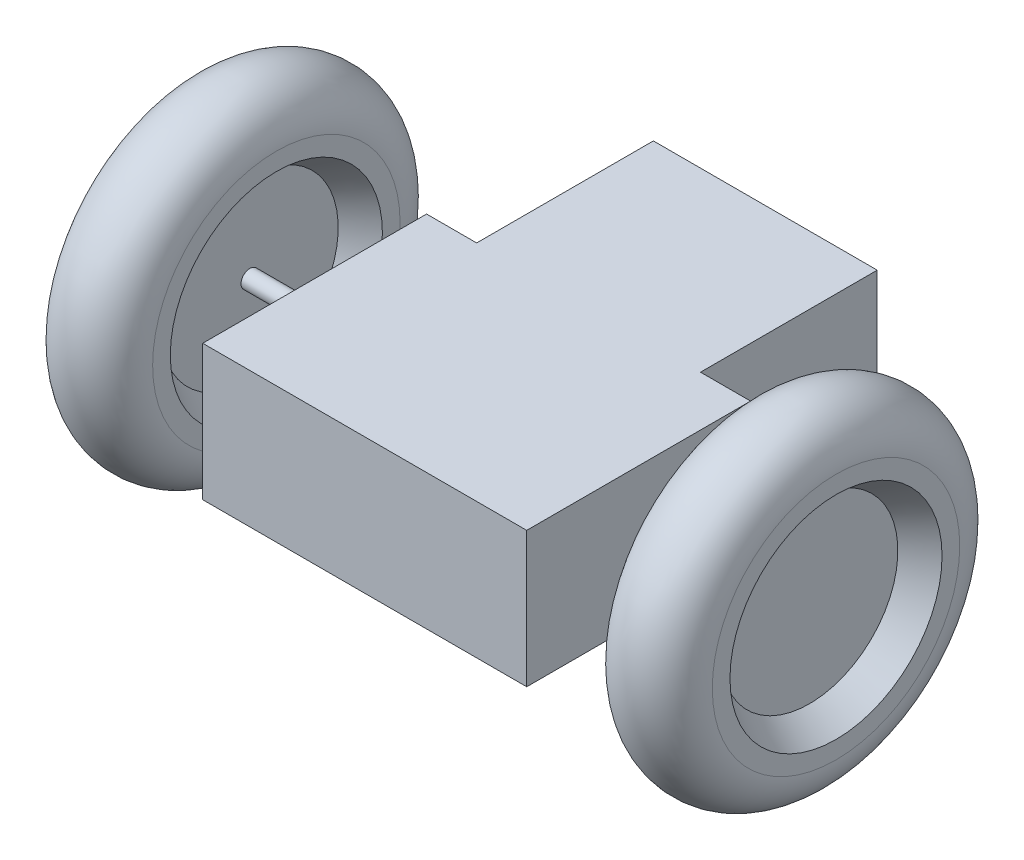
ISO-10303-21;
HEADER;
FILE_DESCRIPTION(('STEP AP214'),'2;1');
FILE_NAME('part.step','',(''),(''),'','','');
FILE_SCHEMA(('AUTOMOTIVE_DESIGN { 1 0 10303 214 1 1 1 1 }'));
ENDSEC;
DATA;
#1=APPLICATION_CONTEXT('core data for automotive mechanical design processes');
#2=APPLICATION_PROTOCOL_DEFINITION('international standard','automotive_design',2000,#1);
#3=PRODUCT_CONTEXT('',#1,'mechanical');
#4=PRODUCT('Part','Part','',(#3));
#5=PRODUCT_RELATED_PRODUCT_CATEGORY('part','',(#4));
#6=PRODUCT_DEFINITION_FORMATION('','',#4);
#7=PRODUCT_DEFINITION_CONTEXT('part definition',#1,'design');
#8=PRODUCT_DEFINITION('design','',#6,#7);
#9=PRODUCT_DEFINITION_SHAPE('','',#8);
#10=(LENGTH_UNIT() NAMED_UNIT(*) SI_UNIT(.MILLI.,.METRE.));
#11=(NAMED_UNIT(*) PLANE_ANGLE_UNIT() SI_UNIT($,.RADIAN.));
#12=(NAMED_UNIT(*) SI_UNIT($,.STERADIAN.) SOLID_ANGLE_UNIT());
#13=UNCERTAINTY_MEASURE_WITH_UNIT(LENGTH_MEASURE(1.E-05),#10,'distance_accuracy_value','');
#14=(GEOMETRIC_REPRESENTATION_CONTEXT(3) GLOBAL_UNCERTAINTY_ASSIGNED_CONTEXT((#13)) GLOBAL_UNIT_ASSIGNED_CONTEXT((#10,
#11,#12)) REPRESENTATION_CONTEXT('',''));
#15=CARTESIAN_POINT('',(0.,0.,0.));
#16=DIRECTION('',(0.,0.,1.));
#17=DIRECTION('',(1.,0.,0.));
#18=AXIS2_PLACEMENT_3D('',#15,#16,#17);
#19=CARTESIAN_POINT('',(27.5,-11.5,-34.));
#20=DIRECTION('',(1.,0.,0.));
#21=DIRECTION('',(0.,0.,-1.));
#22=AXIS2_PLACEMENT_3D('',#19,#20,#21);
#23=PLANE('',#22);
#24=DIRECTION('',(0.,-1.,0.));
#25=VECTOR('',#24,1.);
#26=CARTESIAN_POINT('',(27.5,-9.5,19.));
#27=LINE('',#26,#25);
#28=CARTESIAN_POINT('',(27.5,-9.5,19.));
#29=VERTEX_POINT('',#28);
#30=CARTESIAN_POINT('',(27.5,-11.5,19.));
#31=VERTEX_POINT('',#30);
#32=EDGE_CURVE('E55',#29,#31,#27,.T.);
#33=ORIENTED_EDGE('',*,*,#32,.F.);
#34=DIRECTION('',(0.,0.,-1.));
#35=VECTOR('',#34,1.);
#36=CARTESIAN_POINT('',(27.5,-9.5,19.));
#37=LINE('',#36,#35);
#38=CARTESIAN_POINT('',(27.5,-9.5,11.));
#39=VERTEX_POINT('',#38);
#40=EDGE_CURVE('E50',#29,#39,#37,.T.);
#41=ORIENTED_EDGE('',*,*,#40,.T.);
#42=DIRECTION('',(0.,-1.,0.));
#43=VECTOR('',#42,1.);
#44=CARTESIAN_POINT('',(27.5,-9.5,11.));
#45=LINE('',#44,#43);
#46=CARTESIAN_POINT('',(27.5,-11.5,11.));
#47=VERTEX_POINT('',#46);
#48=EDGE_CURVE('E159',#39,#47,#45,.T.);
#49=ORIENTED_EDGE('',*,*,#48,.T.);
#50=DIRECTION('',(0.,0.,-1.));
#51=VECTOR('',#50,1.);
#52=CARTESIAN_POINT('',(27.5,-11.5,-34.));
#53=LINE('',#52,#51);
#54=CARTESIAN_POINT('',(27.5,-11.5,-4.00000000000001));
#55=VERTEX_POINT('',#54);
#56=EDGE_CURVE('E314',#47,#55,#53,.T.);
#57=ORIENTED_EDGE('',*,*,#56,.T.);
#58=DIRECTION('',(0.,1.,0.));
#59=VECTOR('',#58,1.);
#60=CARTESIAN_POINT('',(27.5,-28.5,-4.00000000000001));
#61=LINE('',#60,#59);
#62=CARTESIAN_POINT('',(27.5,11.5,-4.00000000000001));
#63=VERTEX_POINT('',#62);
#64=EDGE_CURVE('E226',#55,#63,#61,.T.);
#65=ORIENTED_EDGE('',*,*,#64,.T.);
#66=DIRECTION('',(0.,0.,-1.));
#67=VECTOR('',#66,1.);
#68=CARTESIAN_POINT('',(27.5,11.5,-34.));
#69=LINE('',#68,#67);
#70=CARTESIAN_POINT('',(27.5,11.5,34.));
#71=VERTEX_POINT('',#70);
#72=EDGE_CURVE('E303',#71,#63,#69,.T.);
#73=ORIENTED_EDGE('',*,*,#72,.F.);
#74=DIRECTION('',(0.,1.,0.));
#75=VECTOR('',#74,1.);
#76=CARTESIAN_POINT('',(27.5,-11.5,34.));
#77=LINE('',#76,#75);
#78=CARTESIAN_POINT('',(27.5,-11.5,34.));
#79=VERTEX_POINT('',#78);
#80=EDGE_CURVE('E43',#79,#71,#77,.T.);
#81=ORIENTED_EDGE('',*,*,#80,.F.);
#82=EDGE_CURVE('E315',#79,#31,#53,.T.);
#83=ORIENTED_EDGE('',*,*,#82,.T.);
#84=EDGE_LOOP('',(#33,#41,#49,#57,#65,#73,#81,#83));
#85=FACE_BOUND('',#84,.T.);
#86=CARTESIAN_POINT('',(27.5,0.,9.));
#87=DIRECTION('',(1.,0.,0.));
#88=DIRECTION('',(0.,0.,-1.));
#89=AXIS2_PLACEMENT_3D('',#86,#87,#88);
#90=CIRCLE('',#89,1.5);
#91=CARTESIAN_POINT('',(27.5,0.,7.5));
#92=VERTEX_POINT('',#91);
#93=EDGE_CURVE('E295',#92,#92,#90,.T.);
#94=ORIENTED_EDGE('',*,*,#93,.F.);
#95=EDGE_LOOP('',(#94));
#96=FACE_BOUND('',#95,.T.);
#97=ADVANCED_FACE('F35',(#85,#96),#23,.T.);
#98=CARTESIAN_POINT('',(-27.5,-11.5,-34.));
#99=DIRECTION('',(-1.,0.,0.));
#100=DIRECTION('',(0.,0.,1.));
#101=AXIS2_PLACEMENT_3D('',#98,#99,#100);
#102=PLANE('',#101);
#103=DIRECTION('',(0.,-1.,0.));
#104=VECTOR('',#103,1.);
#105=CARTESIAN_POINT('',(-27.5,-9.5,11.));
#106=LINE('',#105,#104);
#107=CARTESIAN_POINT('',(-27.5,-9.5,11.));
#108=VERTEX_POINT('',#107);
#109=CARTESIAN_POINT('',(-27.5,-11.5,11.));
#110=VERTEX_POINT('',#109);
#111=EDGE_CURVE('E211',#108,#110,#106,.T.);
#112=ORIENTED_EDGE('',*,*,#111,.F.);
#113=DIRECTION('',(0.,0.,1.));
#114=VECTOR('',#113,1.);
#115=CARTESIAN_POINT('',(-27.5,-9.5,19.));
#116=LINE('',#115,#114);
#117=CARTESIAN_POINT('',(-27.5,-9.5,19.));
#118=VERTEX_POINT('',#117);
#119=EDGE_CURVE('E191',#108,#118,#116,.T.);
#120=ORIENTED_EDGE('',*,*,#119,.T.);
#121=DIRECTION('',(0.,-1.,0.));
#122=VECTOR('',#121,1.);
#123=CARTESIAN_POINT('',(-27.5,-9.5,19.));
#124=LINE('',#123,#122);
#125=CARTESIAN_POINT('',(-27.5,-11.5,19.));
#126=VERTEX_POINT('',#125);
#127=EDGE_CURVE('E203',#118,#126,#124,.T.);
#128=ORIENTED_EDGE('',*,*,#127,.T.);
#129=DIRECTION('',(0.,0.,1.));
#130=VECTOR('',#129,1.);
#131=CARTESIAN_POINT('',(-27.5,-11.5,-34.));
#132=LINE('',#131,#130);
#133=CARTESIAN_POINT('',(-27.5,-11.5,34.));
#134=VERTEX_POINT('',#133);
#135=EDGE_CURVE('E308',#126,#134,#132,.T.);
#136=ORIENTED_EDGE('',*,*,#135,.T.);
#137=DIRECTION('',(0.,1.,0.));
#138=VECTOR('',#137,1.);
#139=CARTESIAN_POINT('',(-27.5,-11.5,34.));
#140=LINE('',#139,#138);
#141=CARTESIAN_POINT('',(-27.5,11.5,34.));
#142=VERTEX_POINT('',#141);
#143=EDGE_CURVE('E319',#134,#142,#140,.T.);
#144=ORIENTED_EDGE('',*,*,#143,.T.);
#145=DIRECTION('',(0.,0.,1.));
#146=VECTOR('',#145,1.);
#147=CARTESIAN_POINT('',(-27.5,11.5,-34.));
#148=LINE('',#147,#146);
#149=CARTESIAN_POINT('',(-27.5,11.5,-4.00000000000001));
#150=VERTEX_POINT('',#149);
#151=EDGE_CURVE('E298',#150,#142,#148,.T.);
#152=ORIENTED_EDGE('',*,*,#151,.F.);
#153=DIRECTION('',(0.,1.,0.));
#154=VECTOR('',#153,1.);
#155=CARTESIAN_POINT('',(-27.5,-28.5,-4.00000000000001));
#156=LINE('',#155,#154);
#157=CARTESIAN_POINT('',(-27.5,-11.5,-4.00000000000001));
#158=VERTEX_POINT('',#157);
#159=EDGE_CURVE('E242',#158,#150,#156,.T.);
#160=ORIENTED_EDGE('',*,*,#159,.F.);
#161=EDGE_CURVE('E309',#158,#110,#132,.T.);
#162=ORIENTED_EDGE('',*,*,#161,.T.);
#163=EDGE_LOOP('',(#112,#120,#128,#136,#144,#152,#160,#162));
#164=FACE_BOUND('',#163,.T.);
#165=CARTESIAN_POINT('',(-27.5,0.,9.));
#166=DIRECTION('',(-1.,0.,0.));
#167=DIRECTION('',(0.,0.,1.));
#168=AXIS2_PLACEMENT_3D('',#165,#166,#167);
#169=CIRCLE('',#168,1.5);
#170=CARTESIAN_POINT('',(-27.5,0.,10.5));
#171=VERTEX_POINT('',#170);
#172=EDGE_CURVE('E11',#171,#171,#169,.T.);
#173=ORIENTED_EDGE('',*,*,#172,.F.);
#174=EDGE_LOOP('',(#173));
#175=FACE_BOUND('',#174,.T.);
#176=ADVANCED_FACE('F37',(#164,#175),#102,.T.);
#177=CARTESIAN_POINT('',(27.5,-11.5,-34.));
#178=DIRECTION('',(0.,0.,-1.));
#179=DIRECTION('',(-1.,0.,0.));
#180=AXIS2_PLACEMENT_3D('',#177,#178,#179);
#181=PLANE('',#180);
#182=DIRECTION('',(0.,1.,0.));
#183=VECTOR('',#182,1.);
#184=CARTESIAN_POINT('',(19.,-28.5,-34.));
#185=LINE('',#184,#183);
#186=CARTESIAN_POINT('',(19.,-11.5,-34.));
#187=VERTEX_POINT('',#186);
#188=CARTESIAN_POINT('',(19.,11.5,-34.));
#189=VERTEX_POINT('',#188);
#190=EDGE_CURVE('E225',#187,#189,#185,.T.);
#191=ORIENTED_EDGE('',*,*,#190,.F.);
#192=DIRECTION('',(-1.,0.,0.));
#193=VECTOR('',#192,1.);
#194=CARTESIAN_POINT('',(27.5,-11.5,-34.));
#195=LINE('',#194,#193);
#196=CARTESIAN_POINT('',(-19.,-11.5,-34.));
#197=VERTEX_POINT('',#196);
#198=EDGE_CURVE('E317',#187,#197,#195,.T.);
#199=ORIENTED_EDGE('',*,*,#198,.T.);
#200=DIRECTION('',(0.,1.,0.));
#201=VECTOR('',#200,1.);
#202=CARTESIAN_POINT('',(-19.,-28.5,-34.));
#203=LINE('',#202,#201);
#204=CARTESIAN_POINT('',(-19.,11.5,-34.));
#205=VERTEX_POINT('',#204);
#206=EDGE_CURVE('E243',#197,#205,#203,.T.);
#207=ORIENTED_EDGE('',*,*,#206,.T.);
#208=DIRECTION('',(-1.,0.,0.));
#209=VECTOR('',#208,1.);
#210=CARTESIAN_POINT('',(27.5,11.5,-34.));
#211=LINE('',#210,#209);
#212=EDGE_CURVE('E306',#189,#205,#211,.T.);
#213=ORIENTED_EDGE('',*,*,#212,.F.);
#214=EDGE_LOOP('',(#191,#199,#207,#213));
#215=FACE_BOUND('',#214,.T.);
#216=ADVANCED_FACE('F354',(#215),#181,.T.);
#217=CARTESIAN_POINT('',(27.5,-11.5,34.));
#218=DIRECTION('',(0.,0.,1.));
#219=DIRECTION('',(1.,0.,0.));
#220=AXIS2_PLACEMENT_3D('',#217,#218,#219);
#221=PLANE('',#220);
#222=ORIENTED_EDGE('',*,*,#80,.T.);
#223=DIRECTION('',(1.,0.,0.));
#224=VECTOR('',#223,1.);
#225=CARTESIAN_POINT('',(27.5,11.5,34.));
#226=LINE('',#225,#224);
#227=EDGE_CURVE('E300',#142,#71,#226,.T.);
#228=ORIENTED_EDGE('',*,*,#227,.F.);
#229=ORIENTED_EDGE('',*,*,#143,.F.);
#230=DIRECTION('',(1.,0.,0.));
#231=VECTOR('',#230,1.);
#232=CARTESIAN_POINT('',(27.5,-11.5,34.));
#233=LINE('',#232,#231);
#234=EDGE_CURVE('E311',#134,#79,#233,.T.);
#235=ORIENTED_EDGE('',*,*,#234,.T.);
#236=EDGE_LOOP('',(#222,#228,#229,#235));
#237=FACE_BOUND('',#236,.T.);
#238=ADVANCED_FACE('F329',(#237),#221,.T.);
#239=CARTESIAN_POINT('',(0.,-11.5,0.));
#240=DIRECTION('',(0.,-1.,0.));
#241=DIRECTION('',(0.,0.,-1.));
#242=AXIS2_PLACEMENT_3D('',#239,#240,#241);
#243=PLANE('',#242);
#244=DIRECTION('',(-1.,0.,0.));
#245=VECTOR('',#244,1.);
#246=CARTESIAN_POINT('',(0.,-11.5,-4.00000000000001));
#247=LINE('',#246,#245);
#248=CARTESIAN_POINT('',(19.,-11.5,-4.00000000000001));
#249=VERTEX_POINT('',#248);
#250=EDGE_CURVE('E234',#55,#249,#247,.T.);
#251=ORIENTED_EDGE('',*,*,#250,.F.);
#252=ORIENTED_EDGE('',*,*,#56,.F.);
#253=DIRECTION('',(1.,0.,0.));
#254=VECTOR('',#253,1.);
#255=CARTESIAN_POINT('',(27.5,-11.5,11.));
#256=LINE('',#255,#254);
#257=CARTESIAN_POINT('',(32.5,-11.5,11.));
#258=VERTEX_POINT('',#257);
#259=EDGE_CURVE('E175',#47,#258,#256,.T.);
#260=ORIENTED_EDGE('',*,*,#259,.T.);
#261=DIRECTION('',(0.,0.,1.));
#262=VECTOR('',#261,1.);
#263=CARTESIAN_POINT('',(32.5,-11.5,19.));
#264=LINE('',#263,#262);
#265=CARTESIAN_POINT('',(32.5,-11.5,19.));
#266=VERTEX_POINT('',#265);
#267=EDGE_CURVE('E153',#258,#266,#264,.T.);
#268=ORIENTED_EDGE('',*,*,#267,.T.);
#269=DIRECTION('',(-1.,0.,0.));
#270=VECTOR('',#269,1.);
#271=CARTESIAN_POINT('',(27.5,-11.5,19.));
#272=LINE('',#271,#270);
#273=EDGE_CURVE('E170',#266,#31,#272,.T.);
#274=ORIENTED_EDGE('',*,*,#273,.T.);
#275=ORIENTED_EDGE('',*,*,#82,.F.);
#276=ORIENTED_EDGE('',*,*,#234,.F.);
#277=ORIENTED_EDGE('',*,*,#135,.F.);
#278=DIRECTION('',(-1.,0.,0.));
#279=VECTOR('',#278,1.);
#280=CARTESIAN_POINT('',(-27.5,-11.5,19.));
#281=LINE('',#280,#279);
#282=CARTESIAN_POINT('',(-32.5,-11.5,19.));
#283=VERTEX_POINT('',#282);
#284=EDGE_CURVE('E188',#126,#283,#281,.T.);
#285=ORIENTED_EDGE('',*,*,#284,.T.);
#286=DIRECTION('',(0.,0.,-1.));
#287=VECTOR('',#286,1.);
#288=CARTESIAN_POINT('',(-32.5,-11.5,19.));
#289=LINE('',#288,#287);
#290=CARTESIAN_POINT('',(-32.5,-11.5,11.));
#291=VERTEX_POINT('',#290);
#292=EDGE_CURVE('E206',#283,#291,#289,.T.);
#293=ORIENTED_EDGE('',*,*,#292,.T.);
#294=DIRECTION('',(1.,0.,0.));
#295=VECTOR('',#294,1.);
#296=CARTESIAN_POINT('',(-27.5,-11.5,11.));
#297=LINE('',#296,#295);
#298=EDGE_CURVE('E194',#291,#110,#297,.T.);
#299=ORIENTED_EDGE('',*,*,#298,.T.);
#300=ORIENTED_EDGE('',*,*,#161,.F.);
#301=DIRECTION('',(-1.,0.,0.));
#302=VECTOR('',#301,1.);
#303=CARTESIAN_POINT('',(0.,-11.5,-4.00000000000001));
#304=LINE('',#303,#302);
#305=CARTESIAN_POINT('',(-19.,-11.5,-4.00000000000001));
#306=VERTEX_POINT('',#305);
#307=EDGE_CURVE('E246',#306,#158,#304,.T.);
#308=ORIENTED_EDGE('',*,*,#307,.F.);
#309=DIRECTION('',(0.,0.,1.));
#310=VECTOR('',#309,1.);
#311=CARTESIAN_POINT('',(-19.,-11.5,0.));
#312=LINE('',#311,#310);
#313=EDGE_CURVE('E251',#197,#306,#312,.T.);
#314=ORIENTED_EDGE('',*,*,#313,.F.);
#315=ORIENTED_EDGE('',*,*,#198,.F.);
#316=DIRECTION('',(0.,0.,-1.));
#317=VECTOR('',#316,1.);
#318=CARTESIAN_POINT('',(19.,-11.5,0.));
#319=LINE('',#318,#317);
#320=EDGE_CURVE('E229',#249,#187,#319,.T.);
#321=ORIENTED_EDGE('',*,*,#320,.F.);
#322=EDGE_LOOP('',(#251,#252,#260,#268,#274,#275,#276,#277,#285,#293,#299,#300,#308,#314,#315,#321));
#323=FACE_BOUND('',#322,.T.);
#324=CARTESIAN_POINT('',(-30.,-11.5,15.));
#325=DIRECTION('',(0.,-1.,0.));
#326=DIRECTION('',(0.,0.,-1.));
#327=AXIS2_PLACEMENT_3D('',#324,#325,#326);
#328=CIRCLE('',#327,1.5);
#329=CARTESIAN_POINT('',(-30.,-11.5,13.5));
#330=VERTEX_POINT('',#329);
#331=EDGE_CURVE('E182',#330,#330,#328,.T.);
#332=ORIENTED_EDGE('',*,*,#331,.F.);
#333=EDGE_LOOP('',(#332));
#334=FACE_BOUND('',#333,.T.);
#335=CARTESIAN_POINT('',(30.,-11.5,15.));
#336=DIRECTION('',(0.,-1.,0.));
#337=DIRECTION('',(0.,0.,-1.));
#338=AXIS2_PLACEMENT_3D('',#335,#336,#337);
#339=CIRCLE('',#338,1.5);
#340=CARTESIAN_POINT('',(30.,-11.5,13.5));
#341=VERTEX_POINT('',#340);
#342=EDGE_CURVE('E576',#341,#341,#339,.T.);
#343=ORIENTED_EDGE('',*,*,#342,.F.);
#344=EDGE_LOOP('',(#343));
#345=FACE_BOUND('',#344,.T.);
#346=ADVANCED_FACE('F344',(#323,#334,#345),#243,.T.);
#347=CARTESIAN_POINT('',(0.,11.5,0.));
#348=DIRECTION('',(0.,-1.,0.));
#349=DIRECTION('',(0.,0.,-1.));
#350=AXIS2_PLACEMENT_3D('',#347,#348,#349);
#351=PLANE('',#350);
#352=ORIENTED_EDGE('',*,*,#72,.T.);
#353=DIRECTION('',(1.,0.,0.));
#354=VECTOR('',#353,1.);
#355=CARTESIAN_POINT('',(27.5,11.5,-4.00000000000001));
#356=LINE('',#355,#354);
#357=CARTESIAN_POINT('',(19.,11.5,-4.00000000000001));
#358=VERTEX_POINT('',#357);
#359=EDGE_CURVE('E223',#358,#63,#356,.T.);
#360=ORIENTED_EDGE('',*,*,#359,.F.);
#361=DIRECTION('',(0.,0.,1.));
#362=VECTOR('',#361,1.);
#363=CARTESIAN_POINT('',(19.,11.5,-34.));
#364=LINE('',#363,#362);
#365=EDGE_CURVE('E214',#189,#358,#364,.T.);
#366=ORIENTED_EDGE('',*,*,#365,.F.);
#367=ORIENTED_EDGE('',*,*,#212,.T.);
#368=DIRECTION('',(0.,0.,-1.));
#369=VECTOR('',#368,1.);
#370=CARTESIAN_POINT('',(-19.,11.5,-34.));
#371=LINE('',#370,#369);
#372=CARTESIAN_POINT('',(-19.,11.5,-4.00000000000001));
#373=VERTEX_POINT('',#372);
#374=EDGE_CURVE('E239',#373,#205,#371,.T.);
#375=ORIENTED_EDGE('',*,*,#374,.F.);
#376=DIRECTION('',(1.,0.,0.));
#377=VECTOR('',#376,1.);
#378=CARTESIAN_POINT('',(-27.5,11.5,-4.00000000000001));
#379=LINE('',#378,#377);
#380=EDGE_CURVE('E236',#150,#373,#379,.T.);
#381=ORIENTED_EDGE('',*,*,#380,.F.);
#382=ORIENTED_EDGE('',*,*,#151,.T.);
#383=ORIENTED_EDGE('',*,*,#227,.T.);
#384=EDGE_LOOP('',(#352,#360,#366,#367,#375,#381,#382,#383));
#385=FACE_BOUND('',#384,.T.);
#386=ADVANCED_FACE('F332',(#385),#351,.F.);
#387=CARTESIAN_POINT('',(40.,0.,9.));
#388=DIRECTION('',(-1.,0.,0.));
#389=DIRECTION('',(0.,0.,1.));
#390=AXIS2_PLACEMENT_3D('',#387,#388,#389);
#391=CYLINDRICAL_SURFACE('',#390,1.5);
#392=ORIENTED_EDGE('',*,*,#93,.T.);
#393=EDGE_LOOP('',(#392));
#394=FACE_BOUND('',#393,.T.);
#395=CARTESIAN_POINT('',(44.5,0.,9.));
#396=DIRECTION('',(-1.,0.,0.));
#397=DIRECTION('',(0.,0.,1.));
#398=AXIS2_PLACEMENT_3D('',#395,#396,#397);
#399=CIRCLE('',#398,1.5);
#400=CARTESIAN_POINT('',(44.5,0.,10.5));
#401=VERTEX_POINT('',#400);
#402=EDGE_CURVE('E292',#401,#401,#399,.T.);
#403=ORIENTED_EDGE('',*,*,#402,.T.);
#404=EDGE_LOOP('',(#403));
#405=FACE_BOUND('',#404,.T.);
#406=ADVANCED_FACE('F612',(#394,#405),#391,.T.);
#407=CARTESIAN_POINT('',(44.5,0.,7.5));
#408=DIRECTION('',(1.,0.,0.));
#409=DIRECTION('',(0.,0.,-1.));
#410=AXIS2_PLACEMENT_3D('',#407,#408,#409);
#411=PLANE('',#410);
#412=ORIENTED_EDGE('',*,*,#402,.F.);
#413=EDGE_LOOP('',(#412));
#414=FACE_BOUND('',#413,.T.);
#415=CARTESIAN_POINT('',(44.5,0.,9.));
#416=DIRECTION('',(-1.,0.,0.));
#417=DIRECTION('',(0.,0.,1.));
#418=AXIS2_PLACEMENT_3D('',#415,#416,#417);
#419=CIRCLE('',#418,15.);
#420=CARTESIAN_POINT('',(44.5,0.,24.));
#421=VERTEX_POINT('',#420);
#422=EDGE_CURVE('E289',#421,#421,#419,.T.);
#423=ORIENTED_EDGE('',*,*,#422,.T.);
#424=EDGE_LOOP('',(#423));
#425=FACE_BOUND('',#424,.T.);
#426=ADVANCED_FACE('F608',(#414,#425),#411,.F.);
#427=CARTESIAN_POINT('',(40.,0.,9.));
#428=DIRECTION('',(-1.,0.,0.));
#429=DIRECTION('',(0.,0.,1.));
#430=AXIS2_PLACEMENT_3D('',#427,#428,#429);
#431=CONICAL_SURFACE('',#430,18.,0.588002603547568);
#432=ORIENTED_EDGE('',*,*,#422,.F.);
#433=EDGE_LOOP('',(#432));
#434=FACE_BOUND('',#433,.T.);
#435=CARTESIAN_POINT('',(40.,0.,9.));
#436=DIRECTION('',(-1.,0.,0.));
#437=DIRECTION('',(0.,0.,1.));
#438=AXIS2_PLACEMENT_3D('',#435,#436,#437);
#439=CIRCLE('',#438,18.);
#440=CARTESIAN_POINT('',(40.,0.,27.));
#441=VERTEX_POINT('',#440);
#442=EDGE_CURVE('E286',#441,#441,#439,.T.);
#443=ORIENTED_EDGE('',*,*,#442,.T.);
#444=EDGE_LOOP('',(#443));
#445=FACE_BOUND('',#444,.T.);
#446=ADVANCED_FACE('F604',(#434,#445),#431,.F.);
#447=CARTESIAN_POINT('',(40.,0.,-9.00000000000001));
#448=DIRECTION('',(1.,0.,0.));
#449=DIRECTION('',(0.,0.,-1.));
#450=AXIS2_PLACEMENT_3D('',#447,#448,#449);
#451=PLANE('',#450);
#452=ORIENTED_EDGE('',*,*,#442,.F.);
#453=EDGE_LOOP('',(#452));
#454=FACE_BOUND('',#453,.T.);
#455=CARTESIAN_POINT('',(40.,0.,9.));
#456=DIRECTION('',(-1.,0.,0.));
#457=DIRECTION('',(0.,0.,1.));
#458=AXIS2_PLACEMENT_3D('',#455,#456,#457);
#459=CIRCLE('',#458,21.);
#460=CARTESIAN_POINT('',(40.,0.,30.));
#461=VERTEX_POINT('',#460);
#462=EDGE_CURVE('E283',#461,#461,#459,.T.);
#463=ORIENTED_EDGE('',*,*,#462,.T.);
#464=EDGE_LOOP('',(#463));
#465=FACE_BOUND('',#464,.T.);
#466=ADVANCED_FACE('F600',(#454,#465),#451,.F.);
#467=CARTESIAN_POINT('',(47.5,0.,8.99999999999999));
#468=DIRECTION('',(-1.,0.,0.));
#469=DIRECTION('',(0.,0.,1.));
#470=AXIS2_PLACEMENT_3D('',#467,#468,#469);
#471=TOROIDAL_SURFACE('',#470,21.,7.5);
#472=ORIENTED_EDGE('',*,*,#462,.F.);
#473=EDGE_LOOP('',(#472));
#474=FACE_BOUND('',#473,.T.);
#475=CARTESIAN_POINT('',(55.,0.,9.));
#476=DIRECTION('',(-1.,0.,0.));
#477=DIRECTION('',(0.,0.,1.));
#478=AXIS2_PLACEMENT_3D('',#475,#476,#477);
#479=CIRCLE('',#478,21.);
#480=CARTESIAN_POINT('',(55.,0.,30.));
#481=VERTEX_POINT('',#480);
#482=EDGE_CURVE('E280',#481,#481,#479,.T.);
#483=ORIENTED_EDGE('',*,*,#482,.T.);
#484=EDGE_LOOP('',(#483));
#485=FACE_BOUND('',#484,.T.);
#486=ADVANCED_FACE('F596',(#474,#485),#471,.T.);
#487=CARTESIAN_POINT('',(55.,0.,-12.));
#488=DIRECTION('',(-1.,0.,0.));
#489=DIRECTION('',(0.,0.,1.));
#490=AXIS2_PLACEMENT_3D('',#487,#488,#489);
#491=PLANE('',#490);
#492=ORIENTED_EDGE('',*,*,#482,.F.);
#493=EDGE_LOOP('',(#492));
#494=FACE_BOUND('',#493,.T.);
#495=CARTESIAN_POINT('',(55.,0.,9.));
#496=DIRECTION('',(-1.,0.,0.));
#497=DIRECTION('',(0.,0.,1.));
#498=AXIS2_PLACEMENT_3D('',#495,#496,#497);
#499=CIRCLE('',#498,18.);
#500=CARTESIAN_POINT('',(55.,0.,27.));
#501=VERTEX_POINT('',#500);
#502=EDGE_CURVE('E277',#501,#501,#499,.T.);
#503=ORIENTED_EDGE('',*,*,#502,.T.);
#504=EDGE_LOOP('',(#503));
#505=FACE_BOUND('',#504,.T.);
#506=ADVANCED_FACE('F592',(#494,#505),#491,.F.);
#507=CARTESIAN_POINT('',(50.5,0.,9.));
#508=DIRECTION('',(1.,0.,0.));
#509=DIRECTION('',(0.,0.,-1.));
#510=AXIS2_PLACEMENT_3D('',#507,#508,#509);
#511=CONICAL_SURFACE('',#510,15.,0.588002603547568);
#512=ORIENTED_EDGE('',*,*,#502,.F.);
#513=EDGE_LOOP('',(#512));
#514=FACE_BOUND('',#513,.T.);
#515=CARTESIAN_POINT('',(50.5,0.,9.));
#516=DIRECTION('',(-1.,0.,0.));
#517=DIRECTION('',(0.,0.,1.));
#518=AXIS2_PLACEMENT_3D('',#515,#516,#517);
#519=CIRCLE('',#518,15.);
#520=CARTESIAN_POINT('',(50.5,0.,24.));
#521=VERTEX_POINT('',#520);
#522=EDGE_CURVE('E274',#521,#521,#519,.T.);
#523=ORIENTED_EDGE('',*,*,#522,.T.);
#524=EDGE_LOOP('',(#523));
#525=FACE_BOUND('',#524,.T.);
#526=ADVANCED_FACE('F588',(#514,#525),#511,.F.);
#527=CARTESIAN_POINT('',(50.5,0.,-6.00000000000001));
#528=DIRECTION('',(-1.,0.,0.));
#529=DIRECTION('',(0.,0.,1.));
#530=AXIS2_PLACEMENT_3D('',#527,#528,#529);
#531=PLANE('',#530);
#532=ORIENTED_EDGE('',*,*,#522,.F.);
#533=EDGE_LOOP('',(#532));
#534=FACE_BOUND('',#533,.T.);
#535=ADVANCED_FACE('F431',(#534),#531,.F.);
#536=CARTESIAN_POINT('',(-40.,0.,9.));
#537=DIRECTION('',(1.,0.,0.));
#538=DIRECTION('',(0.,0.,-1.));
#539=AXIS2_PLACEMENT_3D('',#536,#537,#538);
#540=CYLINDRICAL_SURFACE('',#539,1.5);
#541=ORIENTED_EDGE('',*,*,#172,.T.);
#542=EDGE_LOOP('',(#541));
#543=FACE_BOUND('',#542,.T.);
#544=CARTESIAN_POINT('',(-44.5,0.,9.));
#545=DIRECTION('',(-1.,0.,0.));
#546=DIRECTION('',(0.,0.,1.));
#547=AXIS2_PLACEMENT_3D('',#544,#545,#546);
#548=CIRCLE('',#547,1.5);
#549=CARTESIAN_POINT('',(-44.5,0.,10.5));
#550=VERTEX_POINT('',#549);
#551=EDGE_CURVE('E271',#550,#550,#548,.T.);
#552=ORIENTED_EDGE('',*,*,#551,.F.);
#553=EDGE_LOOP('',(#552));
#554=FACE_BOUND('',#553,.T.);
#555=ADVANCED_FACE('F425',(#543,#554),#540,.T.);
#556=CARTESIAN_POINT('',(-44.5,0.,7.5));
#557=DIRECTION('',(-1.,0.,0.));
#558=DIRECTION('',(0.,0.,-1.));
#559=AXIS2_PLACEMENT_3D('',#556,#557,#558);
#560=PLANE('',#559);
#561=ORIENTED_EDGE('',*,*,#551,.T.);
#562=EDGE_LOOP('',(#561));
#563=FACE_BOUND('',#562,.T.);
#564=CARTESIAN_POINT('',(-44.5,0.,9.));
#565=DIRECTION('',(-1.,0.,0.));
#566=DIRECTION('',(0.,0.,1.));
#567=AXIS2_PLACEMENT_3D('',#564,#565,#566);
#568=CIRCLE('',#567,15.);
#569=CARTESIAN_POINT('',(-44.5,0.,24.));
#570=VERTEX_POINT('',#569);
#571=EDGE_CURVE('E268',#570,#570,#568,.T.);
#572=ORIENTED_EDGE('',*,*,#571,.F.);
#573=EDGE_LOOP('',(#572));
#574=FACE_BOUND('',#573,.T.);
#575=ADVANCED_FACE('F430',(#563,#574),#560,.F.);
#576=CARTESIAN_POINT('',(-40.,0.,9.));
#577=DIRECTION('',(1.,0.,0.));
#578=DIRECTION('',(0.,0.,1.));
#579=AXIS2_PLACEMENT_3D('',#576,#577,#578);
#580=CONICAL_SURFACE('',#579,18.,0.588002603547568);
#581=ORIENTED_EDGE('',*,*,#571,.T.);
#582=EDGE_LOOP('',(#581));
#583=FACE_BOUND('',#582,.T.);
#584=CARTESIAN_POINT('',(-40.,0.,9.));
#585=DIRECTION('',(-1.,0.,0.));
#586=DIRECTION('',(0.,0.,1.));
#587=AXIS2_PLACEMENT_3D('',#584,#585,#586);
#588=CIRCLE('',#587,18.);
#589=CARTESIAN_POINT('',(-40.,0.,27.));
#590=VERTEX_POINT('',#589);
#591=EDGE_CURVE('E265',#590,#590,#588,.T.);
#592=ORIENTED_EDGE('',*,*,#591,.F.);
#593=EDGE_LOOP('',(#592));
#594=FACE_BOUND('',#593,.T.);
#595=ADVANCED_FACE('F581',(#583,#594),#580,.F.);
#596=CARTESIAN_POINT('',(-40.,0.,-9.00000000000001));
#597=DIRECTION('',(-1.,0.,0.));
#598=DIRECTION('',(0.,0.,-1.));
#599=AXIS2_PLACEMENT_3D('',#596,#597,#598);
#600=PLANE('',#599);
#601=ORIENTED_EDGE('',*,*,#591,.T.);
#602=EDGE_LOOP('',(#601));
#603=FACE_BOUND('',#602,.T.);
#604=CARTESIAN_POINT('',(-40.,0.,9.));
#605=DIRECTION('',(-1.,0.,0.));
#606=DIRECTION('',(0.,0.,1.));
#607=AXIS2_PLACEMENT_3D('',#604,#605,#606);
#608=CIRCLE('',#607,21.);
#609=CARTESIAN_POINT('',(-40.,0.,30.));
#610=VERTEX_POINT('',#609);
#611=EDGE_CURVE('E262',#610,#610,#608,.T.);
#612=ORIENTED_EDGE('',*,*,#611,.F.);
#613=EDGE_LOOP('',(#612));
#614=FACE_BOUND('',#613,.T.);
#615=ADVANCED_FACE('F446',(#603,#614),#600,.F.);
#616=CARTESIAN_POINT('',(-47.5,0.,8.99999999999999));
#617=DIRECTION('',(1.,0.,0.));
#618=DIRECTION('',(0.,0.,1.));
#619=AXIS2_PLACEMENT_3D('',#616,#617,#618);
#620=TOROIDAL_SURFACE('',#619,21.,7.5);
#621=ORIENTED_EDGE('',*,*,#611,.T.);
#622=EDGE_LOOP('',(#621));
#623=FACE_BOUND('',#622,.T.);
#624=CARTESIAN_POINT('',(-55.,0.,9.));
#625=DIRECTION('',(-1.,0.,0.));
#626=DIRECTION('',(0.,0.,1.));
#627=AXIS2_PLACEMENT_3D('',#624,#625,#626);
#628=CIRCLE('',#627,21.);
#629=CARTESIAN_POINT('',(-55.,0.,30.));
#630=VERTEX_POINT('',#629);
#631=EDGE_CURVE('E259',#630,#630,#628,.T.);
#632=ORIENTED_EDGE('',*,*,#631,.F.);
#633=EDGE_LOOP('',(#632));
#634=FACE_BOUND('',#633,.T.);
#635=ADVANCED_FACE('F441',(#623,#634),#620,.T.);
#636=CARTESIAN_POINT('',(-55.,0.,-12.));
#637=DIRECTION('',(1.,0.,0.));
#638=DIRECTION('',(0.,0.,1.));
#639=AXIS2_PLACEMENT_3D('',#636,#637,#638);
#640=PLANE('',#639);
#641=ORIENTED_EDGE('',*,*,#631,.T.);
#642=EDGE_LOOP('',(#641));
#643=FACE_BOUND('',#642,.T.);
#644=CARTESIAN_POINT('',(-55.,0.,9.));
#645=DIRECTION('',(-1.,0.,0.));
#646=DIRECTION('',(0.,0.,1.));
#647=AXIS2_PLACEMENT_3D('',#644,#645,#646);
#648=CIRCLE('',#647,18.);
#649=CARTESIAN_POINT('',(-55.,0.,27.));
#650=VERTEX_POINT('',#649);
#651=EDGE_CURVE('E256',#650,#650,#648,.T.);
#652=ORIENTED_EDGE('',*,*,#651,.F.);
#653=EDGE_LOOP('',(#652));
#654=FACE_BOUND('',#653,.T.);
#655=ADVANCED_FACE('F445',(#643,#654),#640,.F.);
#656=CARTESIAN_POINT('',(-50.5,0.,9.));
#657=DIRECTION('',(-1.,0.,0.));
#658=DIRECTION('',(0.,0.,-1.));
#659=AXIS2_PLACEMENT_3D('',#656,#657,#658);
#660=CONICAL_SURFACE('',#659,15.,0.588002603547568);
#661=ORIENTED_EDGE('',*,*,#651,.T.);
#662=EDGE_LOOP('',(#661));
#663=FACE_BOUND('',#662,.T.);
#664=CARTESIAN_POINT('',(-50.5,0.,9.));
#665=DIRECTION('',(-1.,0.,0.));
#666=DIRECTION('',(0.,0.,1.));
#667=AXIS2_PLACEMENT_3D('',#664,#665,#666);
#668=CIRCLE('',#667,15.);
#669=CARTESIAN_POINT('',(-50.5,0.,24.));
#670=VERTEX_POINT('',#669);
#671=EDGE_CURVE('E253',#670,#670,#668,.T.);
#672=ORIENTED_EDGE('',*,*,#671,.F.);
#673=EDGE_LOOP('',(#672));
#674=FACE_BOUND('',#673,.T.);
#675=ADVANCED_FACE('F460',(#663,#674),#660,.F.);
#676=CARTESIAN_POINT('',(-50.5,0.,-6.00000000000001));
#677=DIRECTION('',(1.,0.,0.));
#678=DIRECTION('',(0.,0.,1.));
#679=AXIS2_PLACEMENT_3D('',#676,#677,#678);
#680=PLANE('',#679);
#681=ORIENTED_EDGE('',*,*,#671,.T.);
#682=EDGE_LOOP('',(#681));
#683=FACE_BOUND('',#682,.T.);
#684=ADVANCED_FACE('F468',(#683),#680,.F.);
#685=CARTESIAN_POINT('',(-19.,-28.5,-34.));
#686=DIRECTION('',(1.,0.,0.));
#687=DIRECTION('',(0.,0.,-1.));
#688=AXIS2_PLACEMENT_3D('',#685,#686,#687);
#689=PLANE('',#688);
#690=ORIENTED_EDGE('',*,*,#313,.T.);
#691=DIRECTION('',(0.,1.,0.));
#692=VECTOR('',#691,1.);
#693=CARTESIAN_POINT('',(-19.,-28.5,-4.00000000000001));
#694=LINE('',#693,#692);
#695=EDGE_CURVE('E247',#306,#373,#694,.T.);
#696=ORIENTED_EDGE('',*,*,#695,.T.);
#697=ORIENTED_EDGE('',*,*,#374,.T.);
#698=ORIENTED_EDGE('',*,*,#206,.F.);
#699=EDGE_LOOP('',(#690,#696,#697,#698));
#700=FACE_BOUND('',#699,.T.);
#701=ADVANCED_FACE('F358',(#700),#689,.F.);
#702=CARTESIAN_POINT('',(-27.5,-28.5,-4.00000000000001));
#703=DIRECTION('',(0.,0.,1.));
#704=DIRECTION('',(1.,0.,0.));
#705=AXIS2_PLACEMENT_3D('',#702,#703,#704);
#706=PLANE('',#705);
#707=ORIENTED_EDGE('',*,*,#307,.T.);
#708=ORIENTED_EDGE('',*,*,#159,.T.);
#709=ORIENTED_EDGE('',*,*,#380,.T.);
#710=ORIENTED_EDGE('',*,*,#695,.F.);
#711=EDGE_LOOP('',(#707,#708,#709,#710));
#712=FACE_BOUND('',#711,.T.);
#713=ADVANCED_FACE('F362',(#712),#706,.F.);
#714=CARTESIAN_POINT('',(27.5,-28.5,-4.00000000000001));
#715=DIRECTION('',(0.,0.,1.));
#716=DIRECTION('',(1.,0.,0.));
#717=AXIS2_PLACEMENT_3D('',#714,#715,#716);
#718=PLANE('',#717);
#719=ORIENTED_EDGE('',*,*,#250,.T.);
#720=DIRECTION('',(0.,1.,0.));
#721=VECTOR('',#720,1.);
#722=CARTESIAN_POINT('',(19.,-28.5,-4.00000000000001));
#723=LINE('',#722,#721);
#724=EDGE_CURVE('E230',#249,#358,#723,.T.);
#725=ORIENTED_EDGE('',*,*,#724,.T.);
#726=ORIENTED_EDGE('',*,*,#359,.T.);
#727=ORIENTED_EDGE('',*,*,#64,.F.);
#728=EDGE_LOOP('',(#719,#725,#726,#727));
#729=FACE_BOUND('',#728,.T.);
#730=ADVANCED_FACE('F340',(#729),#718,.F.);
#731=CARTESIAN_POINT('',(19.,-28.5,-34.));
#732=DIRECTION('',(-1.,0.,0.));
#733=DIRECTION('',(0.,0.,1.));
#734=AXIS2_PLACEMENT_3D('',#731,#732,#733);
#735=PLANE('',#734);
#736=ORIENTED_EDGE('',*,*,#320,.T.);
#737=ORIENTED_EDGE('',*,*,#190,.T.);
#738=ORIENTED_EDGE('',*,*,#365,.T.);
#739=ORIENTED_EDGE('',*,*,#724,.F.);
#740=EDGE_LOOP('',(#736,#737,#738,#739));
#741=FACE_BOUND('',#740,.T.);
#742=ADVANCED_FACE('F350',(#741),#735,.F.);
#743=CARTESIAN_POINT('',(-27.5,-9.5,11.));
#744=DIRECTION('',(0.,0.,-1.));
#745=DIRECTION('',(-1.,0.,0.));
#746=AXIS2_PLACEMENT_3D('',#743,#744,#745);
#747=PLANE('',#746);
#748=ORIENTED_EDGE('',*,*,#298,.F.);
#749=DIRECTION('',(0.,-1.,0.));
#750=VECTOR('',#749,1.);
#751=CARTESIAN_POINT('',(-32.5,-9.5,11.));
#752=LINE('',#751,#750);
#753=CARTESIAN_POINT('',(-32.5,-9.5,11.));
#754=VERTEX_POINT('',#753);
#755=EDGE_CURVE('E215',#754,#291,#752,.T.);
#756=ORIENTED_EDGE('',*,*,#755,.F.);
#757=DIRECTION('',(1.,0.,0.));
#758=VECTOR('',#757,1.);
#759=CARTESIAN_POINT('',(-27.5,-9.5,11.));
#760=LINE('',#759,#758);
#761=EDGE_CURVE('E200',#754,#108,#760,.T.);
#762=ORIENTED_EDGE('',*,*,#761,.T.);
#763=ORIENTED_EDGE('',*,*,#111,.T.);
#764=EDGE_LOOP('',(#748,#756,#762,#763));
#765=FACE_BOUND('',#764,.T.);
#766=ADVANCED_FACE('F367',(#765),#747,.T.);
#767=CARTESIAN_POINT('',(-32.5,-9.5,19.));
#768=DIRECTION('',(-1.,0.,0.));
#769=DIRECTION('',(0.,0.,1.));
#770=AXIS2_PLACEMENT_3D('',#767,#768,#769);
#771=PLANE('',#770);
#772=ORIENTED_EDGE('',*,*,#292,.F.);
#773=DIRECTION('',(0.,-1.,0.));
#774=VECTOR('',#773,1.);
#775=CARTESIAN_POINT('',(-32.5,-9.5,19.));
#776=LINE('',#775,#774);
#777=CARTESIAN_POINT('',(-32.5,-9.5,19.));
#778=VERTEX_POINT('',#777);
#779=EDGE_CURVE('E217',#778,#283,#776,.T.);
#780=ORIENTED_EDGE('',*,*,#779,.F.);
#781=DIRECTION('',(0.,0.,-1.));
#782=VECTOR('',#781,1.);
#783=CARTESIAN_POINT('',(-32.5,-9.5,19.));
#784=LINE('',#783,#782);
#785=EDGE_CURVE('E197',#778,#754,#784,.T.);
#786=ORIENTED_EDGE('',*,*,#785,.T.);
#787=ORIENTED_EDGE('',*,*,#755,.T.);
#788=EDGE_LOOP('',(#772,#780,#786,#787));
#789=FACE_BOUND('',#788,.T.);
#790=ADVANCED_FACE('F506',(#789),#771,.T.);
#791=CARTESIAN_POINT('',(-27.5,-9.5,19.));
#792=DIRECTION('',(0.,0.,1.));
#793=DIRECTION('',(1.,0.,0.));
#794=AXIS2_PLACEMENT_3D('',#791,#792,#793);
#795=PLANE('',#794);
#796=ORIENTED_EDGE('',*,*,#284,.F.);
#797=ORIENTED_EDGE('',*,*,#127,.F.);
#798=DIRECTION('',(-1.,0.,0.));
#799=VECTOR('',#798,1.);
#800=CARTESIAN_POINT('',(-27.5,-9.5,19.));
#801=LINE('',#800,#799);
#802=EDGE_CURVE('E193',#118,#778,#801,.T.);
#803=ORIENTED_EDGE('',*,*,#802,.T.);
#804=ORIENTED_EDGE('',*,*,#779,.T.);
#805=EDGE_LOOP('',(#796,#797,#803,#804));
#806=FACE_BOUND('',#805,.T.);
#807=ADVANCED_FACE('F377',(#806),#795,.T.);
#808=CARTESIAN_POINT('',(0.,-9.5,0.));
#809=DIRECTION('',(0.,1.,0.));
#810=DIRECTION('',(0.,0.,1.));
#811=AXIS2_PLACEMENT_3D('',#808,#809,#810);
#812=PLANE('',#811);
#813=CARTESIAN_POINT('',(-30.,-9.5,15.));
#814=DIRECTION('',(0.,-1.,0.));
#815=DIRECTION('',(0.,0.,-1.));
#816=AXIS2_PLACEMENT_3D('',#813,#814,#815);
#817=CIRCLE('',#816,1.5);
#818=CARTESIAN_POINT('',(-30.,-9.5,13.5));
#819=VERTEX_POINT('',#818);
#820=EDGE_CURVE('E185',#819,#819,#817,.T.);
#821=ORIENTED_EDGE('',*,*,#820,.T.);
#822=EDGE_LOOP('',(#821));
#823=FACE_BOUND('',#822,.T.);
#824=ORIENTED_EDGE('',*,*,#119,.F.);
#825=ORIENTED_EDGE('',*,*,#761,.F.);
#826=ORIENTED_EDGE('',*,*,#785,.F.);
#827=ORIENTED_EDGE('',*,*,#802,.F.);
#828=EDGE_LOOP('',(#824,#825,#826,#827));
#829=FACE_BOUND('',#828,.T.);
#830=ADVANCED_FACE('F373',(#823,#829),#812,.T.);
#831=CARTESIAN_POINT('',(-30.,-9.5,15.));
#832=DIRECTION('',(0.,-1.,0.));
#833=DIRECTION('',(0.,0.,-1.));
#834=AXIS2_PLACEMENT_3D('',#831,#832,#833);
#835=CYLINDRICAL_SURFACE('',#834,1.5);
#836=ORIENTED_EDGE('',*,*,#820,.F.);
#837=EDGE_LOOP('',(#836));
#838=FACE_BOUND('',#837,.T.);
#839=ORIENTED_EDGE('',*,*,#331,.T.);
#840=EDGE_LOOP('',(#839));
#841=FACE_BOUND('',#840,.T.);
#842=ADVANCED_FACE('F382',(#838,#841),#835,.F.);
#843=CARTESIAN_POINT('',(27.5,-9.5,19.));
#844=DIRECTION('',(0.,0.,1.));
#845=DIRECTION('',(1.,0.,0.));
#846=AXIS2_PLACEMENT_3D('',#843,#844,#845);
#847=PLANE('',#846);
#848=ORIENTED_EDGE('',*,*,#273,.F.);
#849=DIRECTION('',(0.,-1.,0.));
#850=VECTOR('',#849,1.);
#851=CARTESIAN_POINT('',(32.5,-9.5,19.));
#852=LINE('',#851,#850);
#853=CARTESIAN_POINT('',(32.5,-9.5,19.));
#854=VERTEX_POINT('',#853);
#855=EDGE_CURVE('E158',#854,#266,#852,.T.);
#856=ORIENTED_EDGE('',*,*,#855,.F.);
#857=DIRECTION('',(-1.,0.,0.));
#858=VECTOR('',#857,1.);
#859=CARTESIAN_POINT('',(27.5,-9.5,19.));
#860=LINE('',#859,#858);
#861=EDGE_CURVE('E166',#854,#29,#860,.T.);
#862=ORIENTED_EDGE('',*,*,#861,.T.);
#863=ORIENTED_EDGE('',*,*,#32,.T.);
#864=EDGE_LOOP('',(#848,#856,#862,#863));
#865=FACE_BOUND('',#864,.T.);
#866=ADVANCED_FACE('F380',(#865),#847,.T.);
#867=CARTESIAN_POINT('',(32.5,-9.5,19.));
#868=DIRECTION('',(1.,0.,0.));
#869=DIRECTION('',(0.,0.,-1.));
#870=AXIS2_PLACEMENT_3D('',#867,#868,#869);
#871=PLANE('',#870);
#872=ORIENTED_EDGE('',*,*,#267,.F.);
#873=DIRECTION('',(0.,-1.,0.));
#874=VECTOR('',#873,1.);
#875=CARTESIAN_POINT('',(32.5,-9.5,11.));
#876=LINE('',#875,#874);
#877=CARTESIAN_POINT('',(32.5,-9.5,11.));
#878=VERTEX_POINT('',#877);
#879=EDGE_CURVE('E147',#878,#258,#876,.T.);
#880=ORIENTED_EDGE('',*,*,#879,.F.);
#881=DIRECTION('',(0.,0.,1.));
#882=VECTOR('',#881,1.);
#883=CARTESIAN_POINT('',(32.5,-9.5,19.));
#884=LINE('',#883,#882);
#885=EDGE_CURVE('E150',#878,#854,#884,.T.);
#886=ORIENTED_EDGE('',*,*,#885,.T.);
#887=ORIENTED_EDGE('',*,*,#855,.T.);
#888=EDGE_LOOP('',(#872,#880,#886,#887));
#889=FACE_BOUND('',#888,.T.);
#890=ADVANCED_FACE('F149',(#889),#871,.T.);
#891=CARTESIAN_POINT('',(27.5,-9.5,11.));
#892=DIRECTION('',(0.,0.,-1.));
#893=DIRECTION('',(-1.,0.,0.));
#894=AXIS2_PLACEMENT_3D('',#891,#892,#893);
#895=PLANE('',#894);
#896=ORIENTED_EDGE('',*,*,#259,.F.);
#897=ORIENTED_EDGE('',*,*,#48,.F.);
#898=DIRECTION('',(1.,0.,0.));
#899=VECTOR('',#898,1.);
#900=CARTESIAN_POINT('',(27.5,-9.5,11.));
#901=LINE('',#900,#899);
#902=EDGE_CURVE('E164',#39,#878,#901,.T.);
#903=ORIENTED_EDGE('',*,*,#902,.T.);
#904=ORIENTED_EDGE('',*,*,#879,.T.);
#905=EDGE_LOOP('',(#896,#897,#903,#904));
#906=FACE_BOUND('',#905,.T.);
#907=ADVANCED_FACE('F168',(#906),#895,.T.);
#908=CARTESIAN_POINT('',(0.,-9.5,0.));
#909=DIRECTION('',(0.,-1.,0.));
#910=DIRECTION('',(0.,0.,-1.));
#911=AXIS2_PLACEMENT_3D('',#908,#909,#910);
#912=PLANE('',#911);
#913=CARTESIAN_POINT('',(30.,-9.5,15.));
#914=DIRECTION('',(0.,-1.,0.));
#915=DIRECTION('',(0.,0.,-1.));
#916=AXIS2_PLACEMENT_3D('',#913,#914,#915);
#917=CIRCLE('',#916,1.5);
#918=CARTESIAN_POINT('',(30.,-9.5,13.5));
#919=VERTEX_POINT('',#918);
#920=EDGE_CURVE('E177',#919,#919,#917,.T.);
#921=ORIENTED_EDGE('',*,*,#920,.T.);
#922=EDGE_LOOP('',(#921));
#923=FACE_BOUND('',#922,.T.);
#924=ORIENTED_EDGE('',*,*,#40,.F.);
#925=ORIENTED_EDGE('',*,*,#861,.F.);
#926=ORIENTED_EDGE('',*,*,#885,.F.);
#927=ORIENTED_EDGE('',*,*,#902,.F.);
#928=EDGE_LOOP('',(#924,#925,#926,#927));
#929=FACE_BOUND('',#928,.T.);
#930=ADVANCED_FACE('F163',(#923,#929),#912,.F.);
#931=CARTESIAN_POINT('',(30.,-9.5,15.));
#932=DIRECTION('',(0.,-1.,0.));
#933=DIRECTION('',(0.,0.,-1.));
#934=AXIS2_PLACEMENT_3D('',#931,#932,#933);
#935=CYLINDRICAL_SURFACE('',#934,1.5);
#936=ORIENTED_EDGE('',*,*,#920,.F.);
#937=EDGE_LOOP('',(#936));
#938=FACE_BOUND('',#937,.T.);
#939=ORIENTED_EDGE('',*,*,#342,.T.);
#940=EDGE_LOOP('',(#939));
#941=FACE_BOUND('',#940,.T.);
#942=ADVANCED_FACE('F558',(#938,#941),#935,.F.);
#943=CLOSED_SHELL('',(#97,#176,#216,#238,#346,#386,#406,#426,#446,#466,#486,#506,#526,#535,#555,
#575,#595,#615,#635,#655,#675,#684,#701,#713,#730,#742,#766,#790,#807,#830,#842,#866,#890,#907,
#930,#942));
#944=MANIFOLD_SOLID_BREP('B2',#943);
#945=ADVANCED_BREP_SHAPE_REPRESENTATION('',(#18,#944),#14);
#946=SHAPE_DEFINITION_REPRESENTATION(#9,#945);
ENDSEC;
END-ISO-10303-21;
